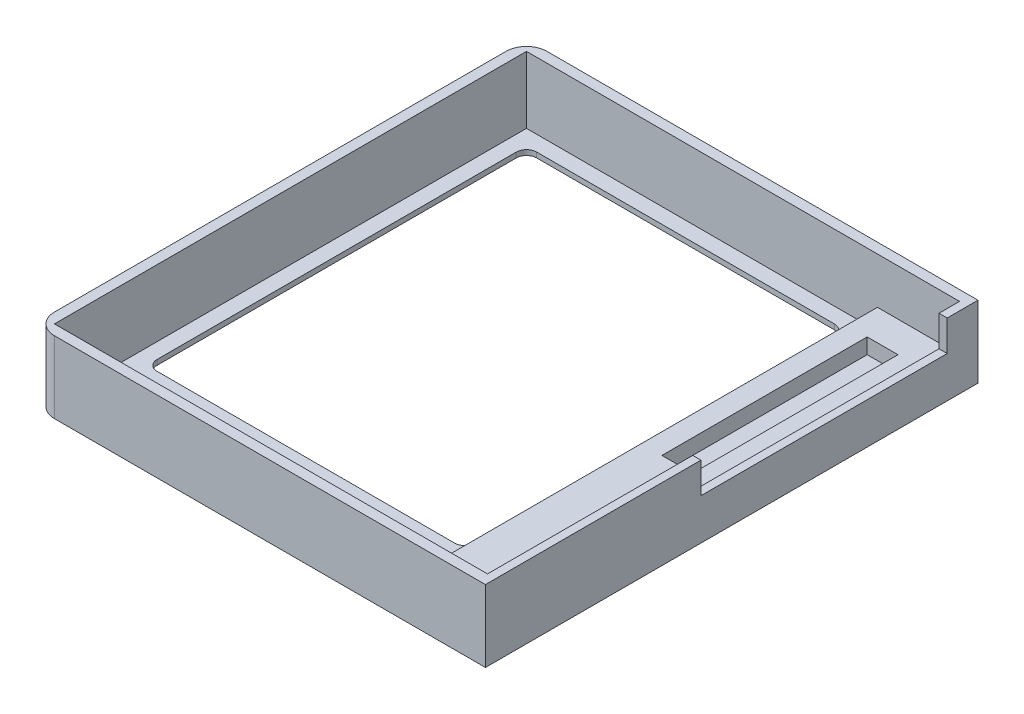
ISO-10303-21;
HEADER;
FILE_DESCRIPTION(('STEP AP214'),'2;1');
FILE_NAME('part.step','',(''),(''),'','','');
FILE_SCHEMA(('AUTOMOTIVE_DESIGN { 1 0 10303 214 1 1 1 1 }'));
ENDSEC;
DATA;
#1=APPLICATION_CONTEXT('core data for automotive mechanical design processes');
#2=APPLICATION_PROTOCOL_DEFINITION('international standard','automotive_design',2000,#1);
#3=PRODUCT_CONTEXT('',#1,'mechanical');
#4=PRODUCT('Part','Part','',(#3));
#5=PRODUCT_RELATED_PRODUCT_CATEGORY('part','',(#4));
#6=PRODUCT_DEFINITION_FORMATION('','',#4);
#7=PRODUCT_DEFINITION_CONTEXT('part definition',#1,'design');
#8=PRODUCT_DEFINITION('design','',#6,#7);
#9=PRODUCT_DEFINITION_SHAPE('','',#8);
#10=(LENGTH_UNIT() NAMED_UNIT(*) SI_UNIT(.MILLI.,.METRE.));
#11=(NAMED_UNIT(*) PLANE_ANGLE_UNIT() SI_UNIT($,.RADIAN.));
#12=(NAMED_UNIT(*) SI_UNIT($,.STERADIAN.) SOLID_ANGLE_UNIT());
#13=UNCERTAINTY_MEASURE_WITH_UNIT(LENGTH_MEASURE(1.E-05),#10,'distance_accuracy_value','');
#14=(GEOMETRIC_REPRESENTATION_CONTEXT(3) GLOBAL_UNCERTAINTY_ASSIGNED_CONTEXT((#13)) GLOBAL_UNIT_ASSIGNED_CONTEXT((#10,
#11,#12)) REPRESENTATION_CONTEXT('',''));
#15=CARTESIAN_POINT('',(0.,0.,0.));
#16=DIRECTION('',(0.,0.,1.));
#17=DIRECTION('',(1.,0.,0.));
#18=AXIS2_PLACEMENT_3D('',#15,#16,#17);
#19=CARTESIAN_POINT('',(1.,0.5,-47.));
#20=DIRECTION('',(0.,0.,-1.));
#21=DIRECTION('',(-1.,0.,0.));
#22=AXIS2_PLACEMENT_3D('',#19,#20,#21);
#23=PLANE('',#22);
#24=DIRECTION('',(0.,-1.,0.));
#25=VECTOR('',#24,1.);
#26=CARTESIAN_POINT('',(35.2,2.5,-47.));
#27=LINE('',#26,#25);
#28=CARTESIAN_POINT('',(35.2,2.5,-47.));
#29=VERTEX_POINT('',#28);
#30=CARTESIAN_POINT('',(35.2,0.5,-47.));
#31=VERTEX_POINT('',#30);
#32=EDGE_CURVE('E290',#29,#31,#27,.T.);
#33=ORIENTED_EDGE('',*,*,#32,.F.);
#34=DIRECTION('',(-1.,0.,0.));
#35=VECTOR('',#34,1.);
#36=CARTESIAN_POINT('',(35.2,2.5,-47.));
#37=LINE('',#36,#35);
#38=CARTESIAN_POINT('',(43.2,2.5,-47.));
#39=VERTEX_POINT('',#38);
#40=EDGE_CURVE('E288',#39,#29,#37,.T.);
#41=ORIENTED_EDGE('',*,*,#40,.F.);
#42=DIRECTION('',(0.,1.,0.));
#43=VECTOR('',#42,1.);
#44=CARTESIAN_POINT('',(43.2,0.5,-47.));
#45=LINE('',#44,#43);
#46=CARTESIAN_POINT('',(43.2,7.,-47.));
#47=VERTEX_POINT('',#46);
#48=EDGE_CURVE('E342',#39,#47,#45,.T.);
#49=ORIENTED_EDGE('',*,*,#48,.T.);
#50=DIRECTION('',(-1.,0.,0.));
#51=VECTOR('',#50,1.);
#52=CARTESIAN_POINT('',(1.,7.,-47.));
#53=LINE('',#52,#51);
#54=CARTESIAN_POINT('',(1.,7.,-47.));
#55=VERTEX_POINT('',#54);
#56=EDGE_CURVE('E323',#47,#55,#53,.T.);
#57=ORIENTED_EDGE('',*,*,#56,.T.);
#58=DIRECTION('',(0.,1.,0.));
#59=VECTOR('',#58,1.);
#60=CARTESIAN_POINT('',(1.,0.5,-47.));
#61=LINE('',#60,#59);
#62=CARTESIAN_POINT('',(1.,0.5,-47.));
#63=VERTEX_POINT('',#62);
#64=EDGE_CURVE('E339',#63,#55,#61,.T.);
#65=ORIENTED_EDGE('',*,*,#64,.F.);
#66=DIRECTION('',(-1.,0.,0.));
#67=VECTOR('',#66,1.);
#68=CARTESIAN_POINT('',(1.,0.5,-47.));
#69=LINE('',#68,#67);
#70=EDGE_CURVE('E326',#31,#63,#69,.T.);
#71=ORIENTED_EDGE('',*,*,#70,.F.);
#72=EDGE_LOOP('',(#33,#41,#49,#57,#65,#71));
#73=FACE_BOUND('',#72,.T.);
#74=ADVANCED_FACE('F33',(#73),#23,.F.);
#75=CARTESIAN_POINT('',(1.,0.5,-1.));
#76=DIRECTION('',(0.,0.,1.));
#77=DIRECTION('',(1.,0.,0.));
#78=AXIS2_PLACEMENT_3D('',#75,#76,#77);
#79=PLANE('',#78);
#80=DIRECTION('',(0.,-1.,0.));
#81=VECTOR('',#80,1.);
#82=CARTESIAN_POINT('',(35.2,2.5,-1.));
#83=LINE('',#82,#81);
#84=CARTESIAN_POINT('',(35.2,2.5,-1.));
#85=VERTEX_POINT('',#84);
#86=CARTESIAN_POINT('',(35.2,0.5,-1.));
#87=VERTEX_POINT('',#86);
#88=EDGE_CURVE('E293',#85,#87,#83,.T.);
#89=ORIENTED_EDGE('',*,*,#88,.T.);
#90=DIRECTION('',(1.,0.,0.));
#91=VECTOR('',#90,1.);
#92=CARTESIAN_POINT('',(1.,0.5,-1.));
#93=LINE('',#92,#91);
#94=CARTESIAN_POINT('',(1.,0.5,-1.));
#95=VERTEX_POINT('',#94);
#96=EDGE_CURVE('E322',#95,#87,#93,.T.);
#97=ORIENTED_EDGE('',*,*,#96,.F.);
#98=DIRECTION('',(0.,1.,0.));
#99=VECTOR('',#98,1.);
#100=CARTESIAN_POINT('',(1.,0.5,-1.));
#101=LINE('',#100,#99);
#102=CARTESIAN_POINT('',(1.,7.,-1.));
#103=VERTEX_POINT('',#102);
#104=EDGE_CURVE('E328',#95,#103,#101,.T.);
#105=ORIENTED_EDGE('',*,*,#104,.T.);
#106=DIRECTION('',(1.,0.,0.));
#107=VECTOR('',#106,1.);
#108=CARTESIAN_POINT('',(1.,7.,-1.));
#109=LINE('',#108,#107);
#110=CARTESIAN_POINT('',(43.2,7.,-1.));
#111=VERTEX_POINT('',#110);
#112=EDGE_CURVE('E330',#103,#111,#109,.T.);
#113=ORIENTED_EDGE('',*,*,#112,.T.);
#114=DIRECTION('',(0.,1.,0.));
#115=VECTOR('',#114,1.);
#116=CARTESIAN_POINT('',(43.2,0.5,-1.));
#117=LINE('',#116,#115);
#118=CARTESIAN_POINT('',(43.2,2.5,-1.));
#119=VERTEX_POINT('',#118);
#120=EDGE_CURVE('E345',#119,#111,#117,.T.);
#121=ORIENTED_EDGE('',*,*,#120,.F.);
#122=DIRECTION('',(1.,0.,0.));
#123=VECTOR('',#122,1.);
#124=CARTESIAN_POINT('',(35.2,2.5,-1.));
#125=LINE('',#124,#123);
#126=EDGE_CURVE('E284',#85,#119,#125,.T.);
#127=ORIENTED_EDGE('',*,*,#126,.F.);
#128=EDGE_LOOP('',(#89,#97,#105,#113,#121,#127));
#129=FACE_BOUND('',#128,.T.);
#130=ADVANCED_FACE('F469',(#129),#79,.F.);
#131=CARTESIAN_POINT('',(0.,0.5,0.));
#132=DIRECTION('',(0.,1.,0.));
#133=DIRECTION('',(0.,0.,1.));
#134=AXIS2_PLACEMENT_3D('',#131,#132,#133);
#135=PLANE('',#134);
#136=DIRECTION('',(0.,0.,1.));
#137=VECTOR('',#136,1.);
#138=CARTESIAN_POINT('',(2.5,0.5,-45.5));
#139=LINE('',#138,#137);
#140=CARTESIAN_POINT('',(2.5,0.5,-44.5));
#141=VERTEX_POINT('',#140);
#142=CARTESIAN_POINT('',(2.5,0.5,-9.5));
#143=VERTEX_POINT('',#142);
#144=EDGE_CURVE('E304',#141,#143,#139,.T.);
#145=ORIENTED_EDGE('',*,*,#144,.F.);
#146=CARTESIAN_POINT('',(3.5,0.5,-44.5));
#147=DIRECTION('',(0.,1.,0.));
#148=DIRECTION('',(0.,0.,1.));
#149=AXIS2_PLACEMENT_3D('',#146,#147,#148);
#150=CIRCLE('',#149,1.);
#151=CARTESIAN_POINT('',(3.5,0.5,-45.5));
#152=VERTEX_POINT('',#151);
#153=EDGE_CURVE('E421',#141,#152,#150,.F.);
#154=ORIENTED_EDGE('',*,*,#153,.T.);
#155=DIRECTION('',(-1.,0.,0.));
#156=VECTOR('',#155,1.);
#157=CARTESIAN_POINT('',(2.5,0.5,-45.5));
#158=LINE('',#157,#156);
#159=CARTESIAN_POINT('',(32.5,0.5,-45.5));
#160=VERTEX_POINT('',#159);
#161=EDGE_CURVE('E312',#160,#152,#158,.T.);
#162=ORIENTED_EDGE('',*,*,#161,.F.);
#163=CARTESIAN_POINT('',(32.5,0.5,-44.5));
#164=DIRECTION('',(0.,1.,0.));
#165=DIRECTION('',(0.,0.,1.));
#166=AXIS2_PLACEMENT_3D('',#163,#164,#165);
#167=CIRCLE('',#166,1.);
#168=CARTESIAN_POINT('',(33.5,0.5,-44.5));
#169=VERTEX_POINT('',#168);
#170=EDGE_CURVE('E413',#160,#169,#167,.F.);
#171=ORIENTED_EDGE('',*,*,#170,.T.);
#172=DIRECTION('',(0.,0.,-1.));
#173=VECTOR('',#172,1.);
#174=CARTESIAN_POINT('',(33.5,0.5,-45.5));
#175=LINE('',#174,#173);
#176=CARTESIAN_POINT('',(33.5,0.5,-9.5));
#177=VERTEX_POINT('',#176);
#178=EDGE_CURVE('E309',#177,#169,#175,.T.);
#179=ORIENTED_EDGE('',*,*,#178,.F.);
#180=CARTESIAN_POINT('',(32.5,0.5,-9.5));
#181=DIRECTION('',(0.,1.,0.));
#182=DIRECTION('',(0.,0.,1.));
#183=AXIS2_PLACEMENT_3D('',#180,#181,#182);
#184=CIRCLE('',#183,1.);
#185=CARTESIAN_POINT('',(32.5,0.5,-8.5));
#186=VERTEX_POINT('',#185);
#187=EDGE_CURVE('E417',#177,#186,#184,.F.);
#188=ORIENTED_EDGE('',*,*,#187,.T.);
#189=DIRECTION('',(1.,0.,0.));
#190=VECTOR('',#189,1.);
#191=CARTESIAN_POINT('',(2.5,0.5,-8.5));
#192=LINE('',#191,#190);
#193=CARTESIAN_POINT('',(3.5,0.5,-8.5));
#194=VERTEX_POINT('',#193);
#195=EDGE_CURVE('E306',#194,#186,#192,.T.);
#196=ORIENTED_EDGE('',*,*,#195,.F.);
#197=CARTESIAN_POINT('',(3.5,0.5,-9.5));
#198=DIRECTION('',(0.,1.,0.));
#199=DIRECTION('',(0.,0.,1.));
#200=AXIS2_PLACEMENT_3D('',#197,#198,#199);
#201=CIRCLE('',#200,1.);
#202=EDGE_CURVE('E41',#194,#143,#201,.F.);
#203=ORIENTED_EDGE('',*,*,#202,.T.);
#204=EDGE_LOOP('',(#145,#154,#162,#171,#179,#188,#196,#203));
#205=FACE_BOUND('',#204,.T.);
#206=ORIENTED_EDGE('',*,*,#96,.T.);
#207=DIRECTION('',(0.,0.,1.));
#208=VECTOR('',#207,1.);
#209=CARTESIAN_POINT('',(35.2,0.5,-47.));
#210=LINE('',#209,#208);
#211=EDGE_CURVE('E275',#31,#87,#210,.T.);
#212=ORIENTED_EDGE('',*,*,#211,.F.);
#213=ORIENTED_EDGE('',*,*,#70,.T.);
#214=DIRECTION('',(0.,0.,1.));
#215=VECTOR('',#214,1.);
#216=CARTESIAN_POINT('',(1.,0.5,-47.));
#217=LINE('',#216,#215);
#218=EDGE_CURVE('E319',#63,#95,#217,.T.);
#219=ORIENTED_EDGE('',*,*,#218,.T.);
#220=EDGE_LOOP('',(#206,#212,#213,#219));
#221=FACE_BOUND('',#220,.T.);
#222=ADVANCED_FACE('F427',(#205,#221),#135,.T.);
#223=CARTESIAN_POINT('',(0.,7.,0.));
#224=DIRECTION('',(1.,0.,0.));
#225=DIRECTION('',(0.,0.,-1.));
#226=AXIS2_PLACEMENT_3D('',#223,#224,#225);
#227=PLANE('',#226);
#228=DIRECTION('',(0.,0.,1.));
#229=VECTOR('',#228,1.);
#230=CARTESIAN_POINT('',(0.,7.,0.));
#231=LINE('',#230,#229);
#232=CARTESIAN_POINT('',(0.,7.,-46.));
#233=VERTEX_POINT('',#232);
#234=CARTESIAN_POINT('',(0.,7.,-2.));
#235=VERTEX_POINT('',#234);
#236=EDGE_CURVE('E349',#233,#235,#231,.T.);
#237=ORIENTED_EDGE('',*,*,#236,.F.);
#238=DIRECTION('',(0.,-1.,0.));
#239=VECTOR('',#238,1.);
#240=CARTESIAN_POINT('',(0.,7.,-46.));
#241=LINE('',#240,#239);
#242=CARTESIAN_POINT('',(0.,0.,-46.));
#243=VERTEX_POINT('',#242);
#244=EDGE_CURVE('E378',#233,#243,#241,.T.);
#245=ORIENTED_EDGE('',*,*,#244,.T.);
#246=DIRECTION('',(0.,0.,1.));
#247=VECTOR('',#246,1.);
#248=CARTESIAN_POINT('',(0.,0.,0.));
#249=LINE('',#248,#247);
#250=CARTESIAN_POINT('',(0.,0.,-2.));
#251=VERTEX_POINT('',#250);
#252=EDGE_CURVE('E341',#243,#251,#249,.T.);
#253=ORIENTED_EDGE('',*,*,#252,.T.);
#254=DIRECTION('',(0.,-1.,0.));
#255=VECTOR('',#254,1.);
#256=CARTESIAN_POINT('',(0.,7.,-2.));
#257=LINE('',#256,#255);
#258=EDGE_CURVE('E376',#251,#235,#257,.F.);
#259=ORIENTED_EDGE('',*,*,#258,.T.);
#260=EDGE_LOOP('',(#237,#245,#253,#259));
#261=FACE_BOUND('',#260,.T.);
#262=ADVANCED_FACE('F506',(#261),#227,.F.);
#263=CARTESIAN_POINT('',(0.,7.,0.));
#264=DIRECTION('',(0.,0.,-1.));
#265=DIRECTION('',(-1.,0.,0.));
#266=AXIS2_PLACEMENT_3D('',#263,#264,#265);
#267=PLANE('',#266);
#268=DIRECTION('',(1.,0.,0.));
#269=VECTOR('',#268,1.);
#270=CARTESIAN_POINT('',(0.,7.,0.));
#271=LINE('',#270,#269);
#272=CARTESIAN_POINT('',(2.,7.,0.));
#273=VERTEX_POINT('',#272);
#274=CARTESIAN_POINT('',(44.,7.,0.));
#275=VERTEX_POINT('',#274);
#276=EDGE_CURVE('E352',#273,#275,#271,.T.);
#277=ORIENTED_EDGE('',*,*,#276,.F.);
#278=DIRECTION('',(0.,-1.,0.));
#279=VECTOR('',#278,1.);
#280=CARTESIAN_POINT('',(2.,7.,0.));
#281=LINE('',#280,#279);
#282=CARTESIAN_POINT('',(2.,0.,0.));
#283=VERTEX_POINT('',#282);
#284=EDGE_CURVE('E391',#273,#283,#281,.T.);
#285=ORIENTED_EDGE('',*,*,#284,.T.);
#286=DIRECTION('',(1.,0.,0.));
#287=VECTOR('',#286,1.);
#288=CARTESIAN_POINT('',(0.,0.,0.));
#289=LINE('',#288,#287);
#290=CARTESIAN_POINT('',(44.,0.,0.));
#291=VERTEX_POINT('',#290);
#292=EDGE_CURVE('E365',#283,#291,#289,.T.);
#293=ORIENTED_EDGE('',*,*,#292,.T.);
#294=DIRECTION('',(0.,-1.,0.));
#295=VECTOR('',#294,1.);
#296=CARTESIAN_POINT('',(44.,7.,0.));
#297=LINE('',#296,#295);
#298=EDGE_CURVE('E373',#275,#291,#297,.T.);
#299=ORIENTED_EDGE('',*,*,#298,.F.);
#300=EDGE_LOOP('',(#277,#285,#293,#299));
#301=FACE_BOUND('',#300,.T.);
#302=ADVANCED_FACE('F502',(#301),#267,.F.);
#303=CARTESIAN_POINT('',(44.,7.,0.));
#304=DIRECTION('',(-1.,0.,0.));
#305=DIRECTION('',(0.,0.,1.));
#306=AXIS2_PLACEMENT_3D('',#303,#304,#305);
#307=PLANE('',#306);
#308=DIRECTION('',(0.,0.,-1.));
#309=VECTOR('',#308,1.);
#310=CARTESIAN_POINT('',(44.,7.,0.));
#311=LINE('',#310,#309);
#312=CARTESIAN_POINT('',(44.,7.,-45.));
#313=VERTEX_POINT('',#312);
#314=CARTESIAN_POINT('',(44.,7.,-48.));
#315=VERTEX_POINT('',#314);
#316=EDGE_CURVE('E355',#313,#315,#311,.T.);
#317=ORIENTED_EDGE('',*,*,#316,.F.);
#318=DIRECTION('',(0.,1.,0.));
#319=VECTOR('',#318,1.);
#320=CARTESIAN_POINT('',(44.,4.,-45.));
#321=LINE('',#320,#319);
#322=CARTESIAN_POINT('',(44.,4.,-45.));
#323=VERTEX_POINT('',#322);
#324=EDGE_CURVE('E276',#323,#313,#321,.T.);
#325=ORIENTED_EDGE('',*,*,#324,.F.);
#326=DIRECTION('',(0.,0.,-1.));
#327=VECTOR('',#326,1.);
#328=CARTESIAN_POINT('',(44.,4.,-45.));
#329=LINE('',#328,#327);
#330=CARTESIAN_POINT('',(44.,4.,-21.));
#331=VERTEX_POINT('',#330);
#332=EDGE_CURVE('E265',#331,#323,#329,.T.);
#333=ORIENTED_EDGE('',*,*,#332,.F.);
#334=DIRECTION('',(0.,1.,0.));
#335=VECTOR('',#334,1.);
#336=CARTESIAN_POINT('',(44.,4.,-21.));
#337=LINE('',#336,#335);
#338=CARTESIAN_POINT('',(44.,7.,-21.));
#339=VERTEX_POINT('',#338);
#340=EDGE_CURVE('E278',#331,#339,#337,.T.);
#341=ORIENTED_EDGE('',*,*,#340,.T.);
#342=EDGE_CURVE('E356',#275,#339,#311,.T.);
#343=ORIENTED_EDGE('',*,*,#342,.F.);
#344=ORIENTED_EDGE('',*,*,#298,.T.);
#345=DIRECTION('',(0.,0.,-1.));
#346=VECTOR('',#345,1.);
#347=CARTESIAN_POINT('',(44.,0.,0.));
#348=LINE('',#347,#346);
#349=CARTESIAN_POINT('',(44.,0.,-48.));
#350=VERTEX_POINT('',#349);
#351=EDGE_CURVE('E367',#291,#350,#348,.T.);
#352=ORIENTED_EDGE('',*,*,#351,.T.);
#353=DIRECTION('',(0.,-1.,0.));
#354=VECTOR('',#353,1.);
#355=CARTESIAN_POINT('',(44.,7.,-48.));
#356=LINE('',#355,#354);
#357=EDGE_CURVE('E362',#315,#350,#356,.T.);
#358=ORIENTED_EDGE('',*,*,#357,.F.);
#359=EDGE_LOOP('',(#317,#325,#333,#341,#343,#344,#352,#358));
#360=FACE_BOUND('',#359,.T.);
#361=ADVANCED_FACE('F498',(#360),#307,.F.);
#362=CARTESIAN_POINT('',(0.,7.,-48.));
#363=DIRECTION('',(0.,0.,1.));
#364=DIRECTION('',(1.,0.,0.));
#365=AXIS2_PLACEMENT_3D('',#362,#363,#364);
#366=PLANE('',#365);
#367=DIRECTION('',(-1.,0.,0.));
#368=VECTOR('',#367,1.);
#369=CARTESIAN_POINT('',(0.,0.,-48.));
#370=LINE('',#369,#368);
#371=CARTESIAN_POINT('',(2.,0.,-48.));
#372=VERTEX_POINT('',#371);
#373=EDGE_CURVE('E353',#350,#372,#370,.T.);
#374=ORIENTED_EDGE('',*,*,#373,.T.);
#375=DIRECTION('',(0.,-1.,0.));
#376=VECTOR('',#375,1.);
#377=CARTESIAN_POINT('',(2.,7.,-48.));
#378=LINE('',#377,#376);
#379=CARTESIAN_POINT('',(2.,7.,-48.));
#380=VERTEX_POINT('',#379);
#381=EDGE_CURVE('E385',#372,#380,#378,.F.);
#382=ORIENTED_EDGE('',*,*,#381,.T.);
#383=DIRECTION('',(-1.,0.,0.));
#384=VECTOR('',#383,1.);
#385=CARTESIAN_POINT('',(0.,7.,-48.));
#386=LINE('',#385,#384);
#387=EDGE_CURVE('E359',#315,#380,#386,.T.);
#388=ORIENTED_EDGE('',*,*,#387,.F.);
#389=ORIENTED_EDGE('',*,*,#357,.T.);
#390=EDGE_LOOP('',(#374,#382,#388,#389));
#391=FACE_BOUND('',#390,.T.);
#392=ADVANCED_FACE('F492',(#391),#366,.F.);
#393=CARTESIAN_POINT('',(0.,7.,0.));
#394=DIRECTION('',(0.,-1.,0.));
#395=DIRECTION('',(0.,0.,-1.));
#396=AXIS2_PLACEMENT_3D('',#393,#394,#395);
#397=PLANE('',#396);
#398=ORIENTED_EDGE('',*,*,#387,.T.);
#399=CARTESIAN_POINT('',(2.,7.,-46.));
#400=DIRECTION('',(0.,-1.,0.));
#401=DIRECTION('',(0.,0.,-1.));
#402=AXIS2_PLACEMENT_3D('',#399,#400,#401);
#403=CIRCLE('',#402,2.);
#404=EDGE_CURVE('E389',#380,#233,#403,.F.);
#405=ORIENTED_EDGE('',*,*,#404,.T.);
#406=ORIENTED_EDGE('',*,*,#236,.T.);
#407=CARTESIAN_POINT('',(2.,7.,-2.));
#408=DIRECTION('',(0.,-1.,0.));
#409=DIRECTION('',(0.,0.,-1.));
#410=AXIS2_PLACEMENT_3D('',#407,#408,#409);
#411=CIRCLE('',#410,2.);
#412=EDGE_CURVE('E387',#235,#273,#411,.F.);
#413=ORIENTED_EDGE('',*,*,#412,.T.);
#414=ORIENTED_EDGE('',*,*,#276,.T.);
#415=ORIENTED_EDGE('',*,*,#342,.T.);
#416=DIRECTION('',(1.,0.,0.));
#417=VECTOR('',#416,1.);
#418=CARTESIAN_POINT('',(43.2,7.,-21.));
#419=LINE('',#418,#417);
#420=CARTESIAN_POINT('',(43.2,7.,-21.));
#421=VERTEX_POINT('',#420);
#422=EDGE_CURVE('E254',#421,#339,#419,.T.);
#423=ORIENTED_EDGE('',*,*,#422,.F.);
#424=DIRECTION('',(0.,0.,-1.));
#425=VECTOR('',#424,1.);
#426=CARTESIAN_POINT('',(43.2,7.,-47.));
#427=LINE('',#426,#425);
#428=EDGE_CURVE('E334',#111,#421,#427,.T.);
#429=ORIENTED_EDGE('',*,*,#428,.F.);
#430=ORIENTED_EDGE('',*,*,#112,.F.);
#431=DIRECTION('',(0.,0.,1.));
#432=VECTOR('',#431,1.);
#433=CARTESIAN_POINT('',(1.,7.,-47.));
#434=LINE('',#433,#432);
#435=EDGE_CURVE('E318',#55,#103,#434,.T.);
#436=ORIENTED_EDGE('',*,*,#435,.F.);
#437=ORIENTED_EDGE('',*,*,#56,.F.);
#438=CARTESIAN_POINT('',(43.2,7.,-45.));
#439=VERTEX_POINT('',#438);
#440=EDGE_CURVE('E333',#439,#47,#427,.T.);
#441=ORIENTED_EDGE('',*,*,#440,.F.);
#442=DIRECTION('',(-1.,0.,0.));
#443=VECTOR('',#442,1.);
#444=CARTESIAN_POINT('',(43.2,7.,-45.));
#445=LINE('',#444,#443);
#446=EDGE_CURVE('E262',#313,#439,#445,.T.);
#447=ORIENTED_EDGE('',*,*,#446,.F.);
#448=ORIENTED_EDGE('',*,*,#316,.T.);
#449=EDGE_LOOP('',(#398,#405,#406,#413,#414,#415,#423,#429,#430,#436,#437,#441,#447,#448));
#450=FACE_BOUND('',#449,.T.);
#451=ADVANCED_FACE('F489',(#450),#397,.F.);
#452=CARTESIAN_POINT('',(0.,0.,0.));
#453=DIRECTION('',(0.,-1.,0.));
#454=DIRECTION('',(0.,0.,-1.));
#455=AXIS2_PLACEMENT_3D('',#452,#453,#454);
#456=PLANE('',#455);
#457=DIRECTION('',(-1.,0.,0.));
#458=VECTOR('',#457,1.);
#459=CARTESIAN_POINT('',(2.5,0.,-45.5));
#460=LINE('',#459,#458);
#461=CARTESIAN_POINT('',(32.5,0.,-45.5));
#462=VERTEX_POINT('',#461);
#463=CARTESIAN_POINT('',(3.5,0.,-45.5));
#464=VERTEX_POINT('',#463);
#465=EDGE_CURVE('E299',#462,#464,#460,.T.);
#466=ORIENTED_EDGE('',*,*,#465,.T.);
#467=CARTESIAN_POINT('',(3.5,0.,-44.5));
#468=DIRECTION('',(0.,-1.,0.));
#469=DIRECTION('',(0.,0.,-1.));
#470=AXIS2_PLACEMENT_3D('',#467,#468,#469);
#471=CIRCLE('',#470,1.);
#472=CARTESIAN_POINT('',(2.5,0.,-44.5));
#473=VERTEX_POINT('',#472);
#474=EDGE_CURVE('E423',#464,#473,#471,.F.);
#475=ORIENTED_EDGE('',*,*,#474,.T.);
#476=DIRECTION('',(0.,0.,1.));
#477=VECTOR('',#476,1.);
#478=CARTESIAN_POINT('',(2.5,0.,-45.5));
#479=LINE('',#478,#477);
#480=CARTESIAN_POINT('',(2.5,0.,-9.5));
#481=VERTEX_POINT('',#480);
#482=EDGE_CURVE('E302',#473,#481,#479,.T.);
#483=ORIENTED_EDGE('',*,*,#482,.T.);
#484=CARTESIAN_POINT('',(3.5,0.,-9.5));
#485=DIRECTION('',(0.,-1.,0.));
#486=DIRECTION('',(0.,0.,-1.));
#487=AXIS2_PLACEMENT_3D('',#484,#485,#486);
#488=CIRCLE('',#487,1.);
#489=CARTESIAN_POINT('',(3.5,0.,-8.5));
#490=VERTEX_POINT('',#489);
#491=EDGE_CURVE('E11',#481,#490,#488,.F.);
#492=ORIENTED_EDGE('',*,*,#491,.T.);
#493=DIRECTION('',(1.,0.,0.));
#494=VECTOR('',#493,1.);
#495=CARTESIAN_POINT('',(2.5,0.,-8.5));
#496=LINE('',#495,#494);
#497=CARTESIAN_POINT('',(32.5,0.,-8.5));
#498=VERTEX_POINT('',#497);
#499=EDGE_CURVE('E315',#490,#498,#496,.T.);
#500=ORIENTED_EDGE('',*,*,#499,.T.);
#501=CARTESIAN_POINT('',(32.5,0.,-9.5));
#502=DIRECTION('',(0.,-1.,0.));
#503=DIRECTION('',(0.,0.,-1.));
#504=AXIS2_PLACEMENT_3D('',#501,#502,#503);
#505=CIRCLE('',#504,1.);
#506=CARTESIAN_POINT('',(33.5,0.,-9.5));
#507=VERTEX_POINT('',#506);
#508=EDGE_CURVE('E419',#498,#507,#505,.F.);
#509=ORIENTED_EDGE('',*,*,#508,.T.);
#510=DIRECTION('',(0.,0.,-1.));
#511=VECTOR('',#510,1.);
#512=CARTESIAN_POINT('',(33.5,0.,-45.5));
#513=LINE('',#512,#511);
#514=CARTESIAN_POINT('',(33.5,0.,-44.5));
#515=VERTEX_POINT('',#514);
#516=EDGE_CURVE('E296',#507,#515,#513,.T.);
#517=ORIENTED_EDGE('',*,*,#516,.T.);
#518=CARTESIAN_POINT('',(32.5,0.,-44.5));
#519=DIRECTION('',(0.,-1.,0.));
#520=DIRECTION('',(0.,0.,-1.));
#521=AXIS2_PLACEMENT_3D('',#518,#519,#520);
#522=CIRCLE('',#521,1.);
#523=EDGE_CURVE('E415',#515,#462,#522,.F.);
#524=ORIENTED_EDGE('',*,*,#523,.T.);
#525=EDGE_LOOP('',(#466,#475,#483,#492,#500,#509,#517,#524));
#526=FACE_BOUND('',#525,.T.);
#527=ORIENTED_EDGE('',*,*,#252,.F.);
#528=CARTESIAN_POINT('',(2.,0.,-46.));
#529=DIRECTION('',(0.,-1.,0.));
#530=DIRECTION('',(0.,0.,-1.));
#531=AXIS2_PLACEMENT_3D('',#528,#529,#530);
#532=CIRCLE('',#531,2.);
#533=EDGE_CURVE('E383',#243,#372,#532,.T.);
#534=ORIENTED_EDGE('',*,*,#533,.T.);
#535=ORIENTED_EDGE('',*,*,#373,.F.);
#536=ORIENTED_EDGE('',*,*,#351,.F.);
#537=ORIENTED_EDGE('',*,*,#292,.F.);
#538=CARTESIAN_POINT('',(2.,0.,-2.));
#539=DIRECTION('',(0.,-1.,0.));
#540=DIRECTION('',(0.,0.,-1.));
#541=AXIS2_PLACEMENT_3D('',#538,#539,#540);
#542=CIRCLE('',#541,2.);
#543=EDGE_CURVE('E381',#283,#251,#542,.T.);
#544=ORIENTED_EDGE('',*,*,#543,.T.);
#545=EDGE_LOOP('',(#527,#534,#535,#536,#537,#544));
#546=FACE_BOUND('',#545,.T.);
#547=ADVANCED_FACE('F436',(#526,#546),#456,.T.);
#548=CARTESIAN_POINT('',(1.,0.5,-47.));
#549=DIRECTION('',(-1.,0.,0.));
#550=DIRECTION('',(0.,0.,1.));
#551=AXIS2_PLACEMENT_3D('',#548,#549,#550);
#552=PLANE('',#551);
#553=ORIENTED_EDGE('',*,*,#435,.T.);
#554=ORIENTED_EDGE('',*,*,#104,.F.);
#555=ORIENTED_EDGE('',*,*,#218,.F.);
#556=ORIENTED_EDGE('',*,*,#64,.T.);
#557=EDGE_LOOP('',(#553,#554,#555,#556));
#558=FACE_BOUND('',#557,.T.);
#559=ADVANCED_FACE('F483',(#558),#552,.F.);
#560=CARTESIAN_POINT('',(43.2,0.5,-47.));
#561=DIRECTION('',(1.,0.,0.));
#562=DIRECTION('',(0.,0.,-1.));
#563=AXIS2_PLACEMENT_3D('',#560,#561,#562);
#564=PLANE('',#563);
#565=DIRECTION('',(0.,0.,1.));
#566=VECTOR('',#565,1.);
#567=CARTESIAN_POINT('',(43.2,4.,-45.));
#568=LINE('',#567,#566);
#569=CARTESIAN_POINT('',(43.2,4.,-45.));
#570=VERTEX_POINT('',#569);
#571=CARTESIAN_POINT('',(43.2,4.,-21.));
#572=VERTEX_POINT('',#571);
#573=EDGE_CURVE('E258',#570,#572,#568,.T.);
#574=ORIENTED_EDGE('',*,*,#573,.F.);
#575=DIRECTION('',(0.,1.,0.));
#576=VECTOR('',#575,1.);
#577=CARTESIAN_POINT('',(43.2,4.,-45.));
#578=LINE('',#577,#576);
#579=EDGE_CURVE('E272',#570,#439,#578,.T.);
#580=ORIENTED_EDGE('',*,*,#579,.T.);
#581=ORIENTED_EDGE('',*,*,#440,.T.);
#582=ORIENTED_EDGE('',*,*,#48,.F.);
#583=DIRECTION('',(0.,0.,-1.));
#584=VECTOR('',#583,1.);
#585=CARTESIAN_POINT('',(43.2,2.5,-47.));
#586=LINE('',#585,#584);
#587=EDGE_CURVE('E286',#119,#39,#586,.T.);
#588=ORIENTED_EDGE('',*,*,#587,.F.);
#589=ORIENTED_EDGE('',*,*,#120,.T.);
#590=ORIENTED_EDGE('',*,*,#428,.T.);
#591=DIRECTION('',(0.,1.,0.));
#592=VECTOR('',#591,1.);
#593=CARTESIAN_POINT('',(43.2,4.,-21.));
#594=LINE('',#593,#592);
#595=EDGE_CURVE('E269',#572,#421,#594,.T.);
#596=ORIENTED_EDGE('',*,*,#595,.F.);
#597=EDGE_LOOP('',(#574,#580,#581,#582,#588,#589,#590,#596));
#598=FACE_BOUND('',#597,.T.);
#599=ADVANCED_FACE('F481',(#598),#564,.F.);
#600=CARTESIAN_POINT('',(2.5,-0.00100000000000002,-45.5));
#601=DIRECTION('',(-1.,0.,0.));
#602=DIRECTION('',(0.,0.,1.));
#603=AXIS2_PLACEMENT_3D('',#600,#601,#602);
#604=PLANE('',#603);
#605=ORIENTED_EDGE('',*,*,#482,.F.);
#606=DIRECTION('',(0.,1.,0.));
#607=VECTOR('',#606,1.);
#608=CARTESIAN_POINT('',(2.5,0.5,-44.5));
#609=LINE('',#608,#607);
#610=EDGE_CURVE('E410',#473,#141,#609,.T.);
#611=ORIENTED_EDGE('',*,*,#610,.T.);
#612=ORIENTED_EDGE('',*,*,#144,.T.);
#613=DIRECTION('',(0.,1.,0.));
#614=VECTOR('',#613,1.);
#615=CARTESIAN_POINT('',(2.5,0.,-9.5));
#616=LINE('',#615,#614);
#617=EDGE_CURVE('E56',#143,#481,#616,.F.);
#618=ORIENTED_EDGE('',*,*,#617,.T.);
#619=EDGE_LOOP('',(#605,#611,#612,#618));
#620=FACE_BOUND('',#619,.T.);
#621=ADVANCED_FACE('F431',(#620),#604,.F.);
#622=CARTESIAN_POINT('',(2.5,-0.00100000000000002,-45.5));
#623=DIRECTION('',(0.,0.,-1.));
#624=DIRECTION('',(-1.,0.,0.));
#625=AXIS2_PLACEMENT_3D('',#622,#623,#624);
#626=PLANE('',#625);
#627=ORIENTED_EDGE('',*,*,#465,.F.);
#628=DIRECTION('',(0.,1.,0.));
#629=VECTOR('',#628,1.);
#630=CARTESIAN_POINT('',(32.5,0.5,-45.5));
#631=LINE('',#630,#629);
#632=EDGE_CURVE('E396',#462,#160,#631,.T.);
#633=ORIENTED_EDGE('',*,*,#632,.T.);
#634=ORIENTED_EDGE('',*,*,#161,.T.);
#635=DIRECTION('',(0.,1.,0.));
#636=VECTOR('',#635,1.);
#637=CARTESIAN_POINT('',(3.5,0.,-45.5));
#638=LINE('',#637,#636);
#639=EDGE_CURVE('E394',#152,#464,#638,.F.);
#640=ORIENTED_EDGE('',*,*,#639,.T.);
#641=EDGE_LOOP('',(#627,#633,#634,#640));
#642=FACE_BOUND('',#641,.T.);
#643=ADVANCED_FACE('F457',(#642),#626,.F.);
#644=CARTESIAN_POINT('',(33.5,-0.00100000000000002,-45.5));
#645=DIRECTION('',(1.,0.,0.));
#646=DIRECTION('',(0.,0.,-1.));
#647=AXIS2_PLACEMENT_3D('',#644,#645,#646);
#648=PLANE('',#647);
#649=ORIENTED_EDGE('',*,*,#178,.T.);
#650=DIRECTION('',(0.,1.,0.));
#651=VECTOR('',#650,1.);
#652=CARTESIAN_POINT('',(33.5,0.,-44.5));
#653=LINE('',#652,#651);
#654=EDGE_CURVE('E402',#169,#515,#653,.F.);
#655=ORIENTED_EDGE('',*,*,#654,.T.);
#656=ORIENTED_EDGE('',*,*,#516,.F.);
#657=DIRECTION('',(0.,1.,0.));
#658=VECTOR('',#657,1.);
#659=CARTESIAN_POINT('',(33.5,0.5,-9.5));
#660=LINE('',#659,#658);
#661=EDGE_CURVE('E399',#507,#177,#660,.T.);
#662=ORIENTED_EDGE('',*,*,#661,.T.);
#663=EDGE_LOOP('',(#649,#655,#656,#662));
#664=FACE_BOUND('',#663,.T.);
#665=ADVANCED_FACE('F448',(#664),#648,.F.);
#666=CARTESIAN_POINT('',(2.5,-0.00100000000000002,-8.5));
#667=DIRECTION('',(0.,0.,1.));
#668=DIRECTION('',(1.,0.,0.));
#669=AXIS2_PLACEMENT_3D('',#666,#667,#668);
#670=PLANE('',#669);
#671=ORIENTED_EDGE('',*,*,#195,.T.);
#672=DIRECTION('',(0.,1.,0.));
#673=VECTOR('',#672,1.);
#674=CARTESIAN_POINT('',(32.5,0.,-8.5));
#675=LINE('',#674,#673);
#676=EDGE_CURVE('E407',#186,#498,#675,.F.);
#677=ORIENTED_EDGE('',*,*,#676,.T.);
#678=ORIENTED_EDGE('',*,*,#499,.F.);
#679=DIRECTION('',(0.,1.,0.));
#680=VECTOR('',#679,1.);
#681=CARTESIAN_POINT('',(3.5,0.5,-8.5));
#682=LINE('',#681,#680);
#683=EDGE_CURVE('E404',#490,#194,#682,.T.);
#684=ORIENTED_EDGE('',*,*,#683,.T.);
#685=EDGE_LOOP('',(#671,#677,#678,#684));
#686=FACE_BOUND('',#685,.T.);
#687=ADVANCED_FACE('F440',(#686),#670,.F.);
#688=CARTESIAN_POINT('',(35.2,2.5,-47.));
#689=DIRECTION('',(1.,0.,0.));
#690=DIRECTION('',(0.,0.,-1.));
#691=AXIS2_PLACEMENT_3D('',#688,#689,#690);
#692=PLANE('',#691);
#693=ORIENTED_EDGE('',*,*,#211,.T.);
#694=ORIENTED_EDGE('',*,*,#88,.F.);
#695=DIRECTION('',(0.,0.,1.));
#696=VECTOR('',#695,1.);
#697=CARTESIAN_POINT('',(35.2,2.5,-47.));
#698=LINE('',#697,#696);
#699=EDGE_CURVE('E282',#29,#85,#698,.T.);
#700=ORIENTED_EDGE('',*,*,#699,.F.);
#701=ORIENTED_EDGE('',*,*,#32,.T.);
#702=EDGE_LOOP('',(#693,#694,#700,#701));
#703=FACE_BOUND('',#702,.T.);
#704=ADVANCED_FACE('F553',(#703),#692,.F.);
#705=CARTESIAN_POINT('',(0.,2.5,0.));
#706=DIRECTION('',(0.,1.,0.));
#707=DIRECTION('',(0.,0.,1.));
#708=AXIS2_PLACEMENT_3D('',#705,#706,#707);
#709=PLANE('',#708);
#710=DIRECTION('',(0.,0.,1.));
#711=VECTOR('',#710,1.);
#712=CARTESIAN_POINT('',(37.2,2.5,-44.));
#713=LINE('',#712,#711);
#714=CARTESIAN_POINT('',(37.2,2.5,-44.));
#715=VERTEX_POINT('',#714);
#716=CARTESIAN_POINT('',(37.2,2.5,-24.));
#717=VERTEX_POINT('',#716);
#718=EDGE_CURVE('E48',#715,#717,#713,.T.);
#719=ORIENTED_EDGE('',*,*,#718,.F.);
#720=DIRECTION('',(-1.,0.,0.));
#721=VECTOR('',#720,1.);
#722=CARTESIAN_POINT('',(37.2,2.5,-44.));
#723=LINE('',#722,#721);
#724=CARTESIAN_POINT('',(40.2,2.5,-44.));
#725=VERTEX_POINT('',#724);
#726=EDGE_CURVE('E239',#725,#715,#723,.T.);
#727=ORIENTED_EDGE('',*,*,#726,.F.);
#728=DIRECTION('',(0.,0.,-1.));
#729=VECTOR('',#728,1.);
#730=CARTESIAN_POINT('',(40.2,2.5,-44.));
#731=LINE('',#730,#729);
#732=CARTESIAN_POINT('',(40.2,2.5,-24.));
#733=VERTEX_POINT('',#732);
#734=EDGE_CURVE('E242',#733,#725,#731,.T.);
#735=ORIENTED_EDGE('',*,*,#734,.F.);
#736=DIRECTION('',(1.,0.,0.));
#737=VECTOR('',#736,1.);
#738=CARTESIAN_POINT('',(37.2,2.5,-24.));
#739=LINE('',#738,#737);
#740=EDGE_CURVE('E248',#717,#733,#739,.T.);
#741=ORIENTED_EDGE('',*,*,#740,.F.);
#742=EDGE_LOOP('',(#719,#727,#735,#741));
#743=FACE_BOUND('',#742,.T.);
#744=ORIENTED_EDGE('',*,*,#699,.T.);
#745=ORIENTED_EDGE('',*,*,#126,.T.);
#746=ORIENTED_EDGE('',*,*,#587,.T.);
#747=ORIENTED_EDGE('',*,*,#40,.T.);
#748=EDGE_LOOP('',(#744,#745,#746,#747));
#749=FACE_BOUND('',#748,.T.);
#750=ADVANCED_FACE('F547',(#743,#749),#709,.T.);
#751=CARTESIAN_POINT('',(43.2,4.,-45.));
#752=DIRECTION('',(0.,0.,-1.));
#753=DIRECTION('',(-1.,0.,0.));
#754=AXIS2_PLACEMENT_3D('',#751,#752,#753);
#755=PLANE('',#754);
#756=ORIENTED_EDGE('',*,*,#446,.T.);
#757=ORIENTED_EDGE('',*,*,#579,.F.);
#758=DIRECTION('',(-1.,0.,0.));
#759=VECTOR('',#758,1.);
#760=CARTESIAN_POINT('',(43.2,4.,-45.));
#761=LINE('',#760,#759);
#762=EDGE_CURVE('E267',#323,#570,#761,.T.);
#763=ORIENTED_EDGE('',*,*,#762,.F.);
#764=ORIENTED_EDGE('',*,*,#324,.T.);
#765=EDGE_LOOP('',(#756,#757,#763,#764));
#766=FACE_BOUND('',#765,.T.);
#767=ADVANCED_FACE('F552',(#766),#755,.F.);
#768=CARTESIAN_POINT('',(43.2,4.,-21.));
#769=DIRECTION('',(0.,0.,1.));
#770=DIRECTION('',(1.,0.,0.));
#771=AXIS2_PLACEMENT_3D('',#768,#769,#770);
#772=PLANE('',#771);
#773=ORIENTED_EDGE('',*,*,#422,.T.);
#774=ORIENTED_EDGE('',*,*,#340,.F.);
#775=DIRECTION('',(1.,0.,0.));
#776=VECTOR('',#775,1.);
#777=CARTESIAN_POINT('',(43.2,4.,-21.));
#778=LINE('',#777,#776);
#779=EDGE_CURVE('E261',#572,#331,#778,.T.);
#780=ORIENTED_EDGE('',*,*,#779,.F.);
#781=ORIENTED_EDGE('',*,*,#595,.T.);
#782=EDGE_LOOP('',(#773,#774,#780,#781));
#783=FACE_BOUND('',#782,.T.);
#784=ADVANCED_FACE('F607',(#783),#772,.F.);
#785=CARTESIAN_POINT('',(0.,4.,0.));
#786=DIRECTION('',(0.,1.,0.));
#787=DIRECTION('',(0.,0.,1.));
#788=AXIS2_PLACEMENT_3D('',#785,#786,#787);
#789=PLANE('',#788);
#790=ORIENTED_EDGE('',*,*,#573,.T.);
#791=ORIENTED_EDGE('',*,*,#779,.T.);
#792=ORIENTED_EDGE('',*,*,#332,.T.);
#793=ORIENTED_EDGE('',*,*,#762,.T.);
#794=EDGE_LOOP('',(#790,#791,#792,#793));
#795=FACE_BOUND('',#794,.T.);
#796=ADVANCED_FACE('F515',(#795),#789,.T.);
#797=CARTESIAN_POINT('',(2.,7.,-46.));
#798=DIRECTION('',(0.,-1.,0.));
#799=DIRECTION('',(0.,0.,-1.));
#800=AXIS2_PLACEMENT_3D('',#797,#798,#799);
#801=CYLINDRICAL_SURFACE('',#800,2.);
#802=ORIENTED_EDGE('',*,*,#404,.F.);
#803=ORIENTED_EDGE('',*,*,#381,.F.);
#804=ORIENTED_EDGE('',*,*,#533,.F.);
#805=ORIENTED_EDGE('',*,*,#244,.F.);
#806=EDGE_LOOP('',(#802,#803,#804,#805));
#807=FACE_BOUND('',#806,.T.);
#808=ADVANCED_FACE('F511',(#807),#801,.T.);
#809=CARTESIAN_POINT('',(2.,7.,-2.));
#810=DIRECTION('',(0.,-1.,0.));
#811=DIRECTION('',(0.,0.,-1.));
#812=AXIS2_PLACEMENT_3D('',#809,#810,#811);
#813=CYLINDRICAL_SURFACE('',#812,2.);
#814=ORIENTED_EDGE('',*,*,#412,.F.);
#815=ORIENTED_EDGE('',*,*,#258,.F.);
#816=ORIENTED_EDGE('',*,*,#543,.F.);
#817=ORIENTED_EDGE('',*,*,#284,.F.);
#818=EDGE_LOOP('',(#814,#815,#816,#817));
#819=FACE_BOUND('',#818,.T.);
#820=ADVANCED_FACE('F514',(#819),#813,.T.);
#821=CARTESIAN_POINT('',(32.5,-0.00100000000000002,-44.5));
#822=DIRECTION('',(0.,-1.,0.));
#823=DIRECTION('',(0.,0.,-1.));
#824=AXIS2_PLACEMENT_3D('',#821,#822,#823);
#825=CYLINDRICAL_SURFACE('',#824,1.);
#826=ORIENTED_EDGE('',*,*,#523,.F.);
#827=ORIENTED_EDGE('',*,*,#654,.F.);
#828=ORIENTED_EDGE('',*,*,#170,.F.);
#829=ORIENTED_EDGE('',*,*,#632,.F.);
#830=EDGE_LOOP('',(#826,#827,#828,#829));
#831=FACE_BOUND('',#830,.T.);
#832=ADVANCED_FACE('F452',(#831),#825,.F.);
#833=CARTESIAN_POINT('',(32.5,-0.00100000000000002,-9.5));
#834=DIRECTION('',(0.,-1.,0.));
#835=DIRECTION('',(0.,0.,-1.));
#836=AXIS2_PLACEMENT_3D('',#833,#834,#835);
#837=CYLINDRICAL_SURFACE('',#836,1.);
#838=ORIENTED_EDGE('',*,*,#508,.F.);
#839=ORIENTED_EDGE('',*,*,#676,.F.);
#840=ORIENTED_EDGE('',*,*,#187,.F.);
#841=ORIENTED_EDGE('',*,*,#661,.F.);
#842=EDGE_LOOP('',(#838,#839,#840,#841));
#843=FACE_BOUND('',#842,.T.);
#844=ADVANCED_FACE('F443',(#843),#837,.F.);
#845=CARTESIAN_POINT('',(3.5,-0.00100000000000002,-44.5));
#846=DIRECTION('',(0.,-1.,0.));
#847=DIRECTION('',(0.,0.,-1.));
#848=AXIS2_PLACEMENT_3D('',#845,#846,#847);
#849=CYLINDRICAL_SURFACE('',#848,1.);
#850=ORIENTED_EDGE('',*,*,#474,.F.);
#851=ORIENTED_EDGE('',*,*,#639,.F.);
#852=ORIENTED_EDGE('',*,*,#153,.F.);
#853=ORIENTED_EDGE('',*,*,#610,.F.);
#854=EDGE_LOOP('',(#850,#851,#852,#853));
#855=FACE_BOUND('',#854,.T.);
#856=ADVANCED_FACE('F461',(#855),#849,.F.);
#857=CARTESIAN_POINT('',(3.5,-0.00100000000000002,-9.5));
#858=DIRECTION('',(0.,-1.,0.));
#859=DIRECTION('',(0.,0.,-1.));
#860=AXIS2_PLACEMENT_3D('',#857,#858,#859);
#861=CYLINDRICAL_SURFACE('',#860,1.);
#862=ORIENTED_EDGE('',*,*,#491,.F.);
#863=ORIENTED_EDGE('',*,*,#617,.F.);
#864=ORIENTED_EDGE('',*,*,#202,.F.);
#865=ORIENTED_EDGE('',*,*,#683,.F.);
#866=EDGE_LOOP('',(#862,#863,#864,#865));
#867=FACE_BOUND('',#866,.T.);
#868=ADVANCED_FACE('F35',(#867),#861,.F.);
#869=CARTESIAN_POINT('',(37.2,1.,-44.));
#870=DIRECTION('',(-1.,0.,0.));
#871=DIRECTION('',(0.,0.,1.));
#872=AXIS2_PLACEMENT_3D('',#869,#870,#871);
#873=PLANE('',#872);
#874=ORIENTED_EDGE('',*,*,#718,.T.);
#875=DIRECTION('',(0.,1.,0.));
#876=VECTOR('',#875,1.);
#877=CARTESIAN_POINT('',(37.2,1.,-24.));
#878=LINE('',#877,#876);
#879=CARTESIAN_POINT('',(37.2,1.,-24.));
#880=VERTEX_POINT('',#879);
#881=EDGE_CURVE('E217',#880,#717,#878,.T.);
#882=ORIENTED_EDGE('',*,*,#881,.F.);
#883=DIRECTION('',(0.,0.,1.));
#884=VECTOR('',#883,1.);
#885=CARTESIAN_POINT('',(37.2,1.,-44.));
#886=LINE('',#885,#884);
#887=CARTESIAN_POINT('',(37.2,1.,-44.));
#888=VERTEX_POINT('',#887);
#889=EDGE_CURVE('E221',#888,#880,#886,.T.);
#890=ORIENTED_EDGE('',*,*,#889,.F.);
#891=DIRECTION('',(0.,1.,0.));
#892=VECTOR('',#891,1.);
#893=CARTESIAN_POINT('',(37.2,1.,-44.));
#894=LINE('',#893,#892);
#895=EDGE_CURVE('E252',#888,#715,#894,.T.);
#896=ORIENTED_EDGE('',*,*,#895,.T.);
#897=EDGE_LOOP('',(#874,#882,#890,#896));
#898=FACE_BOUND('',#897,.T.);
#899=ADVANCED_FACE('F219',(#898),#873,.F.);
#900=CARTESIAN_POINT('',(37.2,1.,-44.));
#901=DIRECTION('',(0.,0.,-1.));
#902=DIRECTION('',(-1.,0.,0.));
#903=AXIS2_PLACEMENT_3D('',#900,#901,#902);
#904=PLANE('',#903);
#905=ORIENTED_EDGE('',*,*,#726,.T.);
#906=ORIENTED_EDGE('',*,*,#895,.F.);
#907=DIRECTION('',(-1.,0.,0.));
#908=VECTOR('',#907,1.);
#909=CARTESIAN_POINT('',(37.2,1.,-44.));
#910=LINE('',#909,#908);
#911=CARTESIAN_POINT('',(40.2,1.,-44.));
#912=VERTEX_POINT('',#911);
#913=EDGE_CURVE('E227',#912,#888,#910,.T.);
#914=ORIENTED_EDGE('',*,*,#913,.F.);
#915=DIRECTION('',(0.,1.,0.));
#916=VECTOR('',#915,1.);
#917=CARTESIAN_POINT('',(40.2,1.,-44.));
#918=LINE('',#917,#916);
#919=EDGE_CURVE('E255',#912,#725,#918,.T.);
#920=ORIENTED_EDGE('',*,*,#919,.T.);
#921=EDGE_LOOP('',(#905,#906,#914,#920));
#922=FACE_BOUND('',#921,.T.);
#923=ADVANCED_FACE('F565',(#922),#904,.F.);
#924=CARTESIAN_POINT('',(40.2,1.,-44.));
#925=DIRECTION('',(1.,0.,0.));
#926=DIRECTION('',(0.,0.,-1.));
#927=AXIS2_PLACEMENT_3D('',#924,#925,#926);
#928=PLANE('',#927);
#929=ORIENTED_EDGE('',*,*,#734,.T.);
#930=ORIENTED_EDGE('',*,*,#919,.F.);
#931=DIRECTION('',(0.,0.,-1.));
#932=VECTOR('',#931,1.);
#933=CARTESIAN_POINT('',(40.2,1.,-44.));
#934=LINE('',#933,#932);
#935=CARTESIAN_POINT('',(40.2,1.,-24.));
#936=VERTEX_POINT('',#935);
#937=EDGE_CURVE('E235',#936,#912,#934,.T.);
#938=ORIENTED_EDGE('',*,*,#937,.F.);
#939=DIRECTION('',(0.,1.,0.));
#940=VECTOR('',#939,1.);
#941=CARTESIAN_POINT('',(40.2,1.,-24.));
#942=LINE('',#941,#940);
#943=EDGE_CURVE('E226',#936,#733,#942,.T.);
#944=ORIENTED_EDGE('',*,*,#943,.T.);
#945=EDGE_LOOP('',(#929,#930,#938,#944));
#946=FACE_BOUND('',#945,.T.);
#947=ADVANCED_FACE('F574',(#946),#928,.F.);
#948=CARTESIAN_POINT('',(37.2,1.,-24.));
#949=DIRECTION('',(0.,0.,1.));
#950=DIRECTION('',(1.,0.,0.));
#951=AXIS2_PLACEMENT_3D('',#948,#949,#950);
#952=PLANE('',#951);
#953=ORIENTED_EDGE('',*,*,#740,.T.);
#954=ORIENTED_EDGE('',*,*,#943,.F.);
#955=DIRECTION('',(1.,0.,0.));
#956=VECTOR('',#955,1.);
#957=CARTESIAN_POINT('',(37.2,1.,-24.));
#958=LINE('',#957,#956);
#959=EDGE_CURVE('E230',#880,#936,#958,.T.);
#960=ORIENTED_EDGE('',*,*,#959,.F.);
#961=ORIENTED_EDGE('',*,*,#881,.T.);
#962=EDGE_LOOP('',(#953,#954,#960,#961));
#963=FACE_BOUND('',#962,.T.);
#964=ADVANCED_FACE('F231',(#963),#952,.F.);
#965=CARTESIAN_POINT('',(0.,1.,0.));
#966=DIRECTION('',(0.,1.,0.));
#967=DIRECTION('',(0.,0.,1.));
#968=AXIS2_PLACEMENT_3D('',#965,#966,#967);
#969=PLANE('',#968);
#970=ORIENTED_EDGE('',*,*,#889,.T.);
#971=ORIENTED_EDGE('',*,*,#959,.T.);
#972=ORIENTED_EDGE('',*,*,#937,.T.);
#973=ORIENTED_EDGE('',*,*,#913,.T.);
#974=EDGE_LOOP('',(#970,#971,#972,#973));
#975=FACE_BOUND('',#974,.T.);
#976=ADVANCED_FACE('F237',(#975),#969,.T.);
#977=CLOSED_SHELL('',(#74,#130,#222,#262,#302,#361,#392,#451,#547,#559,#599,#621,#643,#665,#687,
#704,#750,#767,#784,#796,#808,#820,#832,#844,#856,#868,#899,#923,#947,#964,#976));
#978=MANIFOLD_SOLID_BREP('B2',#977);
#979=ADVANCED_BREP_SHAPE_REPRESENTATION('',(#18,#978),#14);
#980=SHAPE_DEFINITION_REPRESENTATION(#9,#979);
ENDSEC;
END-ISO-10303-21;
